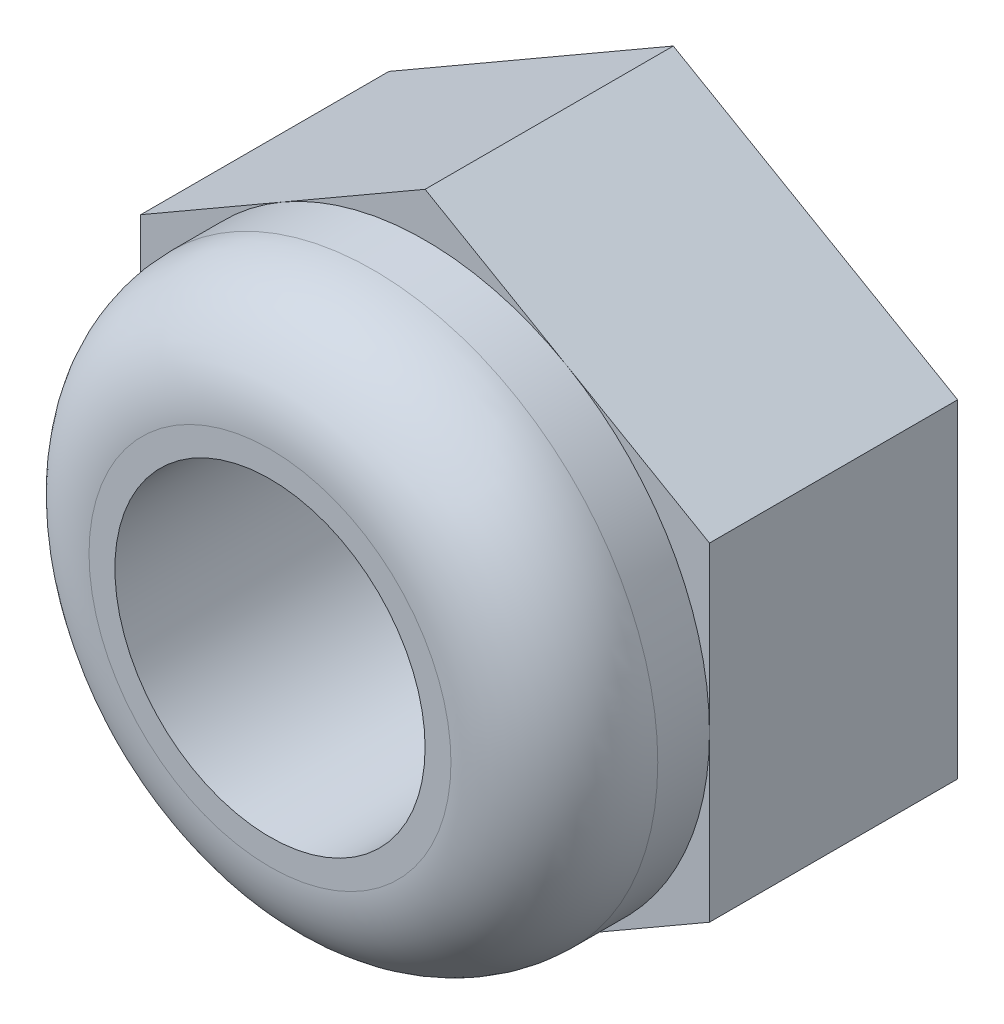
ISO-10303-21;
HEADER;
FILE_DESCRIPTION(('STEP AP214'),'2;1');
FILE_NAME('part.step','',(''),(''),'','','');
FILE_SCHEMA(('AUTOMOTIVE_DESIGN { 1 0 10303 214 1 1 1 1 }'));
ENDSEC;
DATA;
#1=APPLICATION_CONTEXT('core data for automotive mechanical design processes');
#2=APPLICATION_PROTOCOL_DEFINITION('international standard','automotive_design',2000,#1);
#3=PRODUCT_CONTEXT('',#1,'mechanical');
#4=PRODUCT('Part','Part','',(#3));
#5=PRODUCT_RELATED_PRODUCT_CATEGORY('part','',(#4));
#6=PRODUCT_DEFINITION_FORMATION('','',#4);
#7=PRODUCT_DEFINITION_CONTEXT('part definition',#1,'design');
#8=PRODUCT_DEFINITION('design','',#6,#7);
#9=PRODUCT_DEFINITION_SHAPE('','',#8);
#10=(LENGTH_UNIT() NAMED_UNIT(*) SI_UNIT(.MILLI.,.METRE.));
#11=(NAMED_UNIT(*) PLANE_ANGLE_UNIT() SI_UNIT($,.RADIAN.));
#12=(NAMED_UNIT(*) SI_UNIT($,.STERADIAN.) SOLID_ANGLE_UNIT());
#13=UNCERTAINTY_MEASURE_WITH_UNIT(LENGTH_MEASURE(1.E-05),#10,'distance_accuracy_value','');
#14=(GEOMETRIC_REPRESENTATION_CONTEXT(3) GLOBAL_UNCERTAINTY_ASSIGNED_CONTEXT((#13)) GLOBAL_UNIT_ASSIGNED_CONTEXT((#10,
#11,#12)) REPRESENTATION_CONTEXT('',''));
#15=CARTESIAN_POINT('',(0.,0.,0.));
#16=DIRECTION('',(0.,0.,1.));
#17=DIRECTION('',(1.,0.,0.));
#18=AXIS2_PLACEMENT_3D('',#15,#16,#17);
#19=CARTESIAN_POINT('',(0.,0.,2.4));
#20=DIRECTION('',(0.,0.,1.));
#21=DIRECTION('',(1.,0.,0.));
#22=AXIS2_PLACEMENT_3D('',#19,#20,#21);
#23=PLANE('',#22);
#24=CARTESIAN_POINT('',(0.,0.,2.4));
#25=DIRECTION('',(0.,0.,1.));
#26=DIRECTION('',(1.,0.,0.));
#27=AXIS2_PLACEMENT_3D('',#24,#25,#26);
#28=CIRCLE('',#27,2.75);
#29=CARTESIAN_POINT('',(2.75,0.,2.4));
#30=VERTEX_POINT('',#29);
#31=CARTESIAN_POINT('',(1.375,2.38156986040721,2.4));
#32=VERTEX_POINT('',#31);
#33=EDGE_CURVE('E131',#30,#32,#28,.T.);
#34=ORIENTED_EDGE('',*,*,#33,.F.);
#35=DIRECTION('',(0.,1.,0.));
#36=VECTOR('',#35,1.);
#37=CARTESIAN_POINT('',(2.75,-1.58771324027147,2.4));
#38=LINE('',#37,#36);
#39=CARTESIAN_POINT('',(2.75,1.58771324027147,2.4));
#40=VERTEX_POINT('',#39);
#41=EDGE_CURVE('E119',#30,#40,#38,.T.);
#42=ORIENTED_EDGE('',*,*,#41,.T.);
#43=DIRECTION('',(-0.866025403784439,0.5,0.));
#44=VECTOR('',#43,1.);
#45=CARTESIAN_POINT('',(2.75,1.58771324027147,2.4));
#46=LINE('',#45,#44);
#47=EDGE_CURVE('E132',#40,#32,#46,.T.);
#48=ORIENTED_EDGE('',*,*,#47,.T.);
#49=EDGE_LOOP('',(#34,#42,#48));
#50=FACE_BOUND('',#49,.T.);
#51=ADVANCED_FACE('F36',(#50),#23,.T.);
#52=CARTESIAN_POINT('',(-1.375,2.38156986040721,2.4));
#53=VERTEX_POINT('',#52);
#54=EDGE_CURVE('E138',#32,#53,#28,.T.);
#55=ORIENTED_EDGE('',*,*,#54,.F.);
#56=CARTESIAN_POINT('',(0.,3.17542648054294,2.4));
#57=VERTEX_POINT('',#56);
#58=EDGE_CURVE('E118',#32,#57,#46,.T.);
#59=ORIENTED_EDGE('',*,*,#58,.T.);
#60=DIRECTION('',(-0.866025403784439,-0.5,0.));
#61=VECTOR('',#60,1.);
#62=CARTESIAN_POINT('',(0.,3.17542648054294,2.4));
#63=LINE('',#62,#61);
#64=EDGE_CURVE('E148',#57,#53,#63,.T.);
#65=ORIENTED_EDGE('',*,*,#64,.T.);
#66=EDGE_LOOP('',(#55,#59,#65));
#67=FACE_BOUND('',#66,.T.);
#68=ADVANCED_FACE('F196',(#67),#23,.T.);
#69=CARTESIAN_POINT('',(-2.75,0.,2.4));
#70=VERTEX_POINT('',#69);
#71=EDGE_CURVE('E185',#53,#70,#28,.T.);
#72=ORIENTED_EDGE('',*,*,#71,.F.);
#73=CARTESIAN_POINT('',(-2.75,1.58771324027147,2.4));
#74=VERTEX_POINT('',#73);
#75=EDGE_CURVE('E147',#53,#74,#63,.T.);
#76=ORIENTED_EDGE('',*,*,#75,.T.);
#77=DIRECTION('',(0.,-1.,0.));
#78=VECTOR('',#77,1.);
#79=CARTESIAN_POINT('',(-2.75,1.58771324027147,2.4));
#80=LINE('',#79,#78);
#81=EDGE_CURVE('E152',#74,#70,#80,.T.);
#82=ORIENTED_EDGE('',*,*,#81,.T.);
#83=EDGE_LOOP('',(#72,#76,#82));
#84=FACE_BOUND('',#83,.T.);
#85=ADVANCED_FACE('F189',(#84),#23,.T.);
#86=CARTESIAN_POINT('',(-1.375,-2.38156986040721,2.4));
#87=VERTEX_POINT('',#86);
#88=EDGE_CURVE('E59',#70,#87,#28,.T.);
#89=ORIENTED_EDGE('',*,*,#88,.F.);
#90=CARTESIAN_POINT('',(-2.75,-1.58771324027147,2.4));
#91=VERTEX_POINT('',#90);
#92=EDGE_CURVE('E151',#70,#91,#80,.T.);
#93=ORIENTED_EDGE('',*,*,#92,.T.);
#94=DIRECTION('',(0.866025403784439,-0.5,0.));
#95=VECTOR('',#94,1.);
#96=CARTESIAN_POINT('',(-2.75,-1.58771324027147,2.4));
#97=LINE('',#96,#95);
#98=EDGE_CURVE('E156',#91,#87,#97,.T.);
#99=ORIENTED_EDGE('',*,*,#98,.T.);
#100=EDGE_LOOP('',(#89,#93,#99));
#101=FACE_BOUND('',#100,.T.);
#102=ADVANCED_FACE('F215',(#101),#23,.T.);
#103=CARTESIAN_POINT('',(1.375,-2.3815698604072,2.4));
#104=VERTEX_POINT('',#103);
#105=EDGE_CURVE('E51',#87,#104,#28,.T.);
#106=ORIENTED_EDGE('',*,*,#105,.F.);
#107=CARTESIAN_POINT('',(0.,-3.17542648054294,2.4));
#108=VERTEX_POINT('',#107);
#109=EDGE_CURVE('E155',#87,#108,#97,.T.);
#110=ORIENTED_EDGE('',*,*,#109,.T.);
#111=DIRECTION('',(0.866025403784438,0.5,0.));
#112=VECTOR('',#111,1.);
#113=CARTESIAN_POINT('',(0.,-3.17542648054294,2.4));
#114=LINE('',#113,#112);
#115=EDGE_CURVE('E129',#108,#104,#114,.T.);
#116=ORIENTED_EDGE('',*,*,#115,.T.);
#117=EDGE_LOOP('',(#106,#110,#116));
#118=FACE_BOUND('',#117,.T.);
#119=ADVANCED_FACE('F217',(#118),#23,.T.);
#120=CARTESIAN_POINT('',(0.,-3.17542648054294,2.4));
#121=DIRECTION('',(-0.5,0.866025403784438,0.));
#122=DIRECTION('',(-0.866025403784438,-0.5,0.));
#123=AXIS2_PLACEMENT_3D('',#120,#121,#122);
#124=PLANE('',#123);
#125=DIRECTION('',(0.866025403784438,0.5,0.));
#126=VECTOR('',#125,1.);
#127=CARTESIAN_POINT('',(0.,-3.17542648054294,0.));
#128=LINE('',#127,#126);
#129=CARTESIAN_POINT('',(0.,-3.17542648054294,0.));
#130=VERTEX_POINT('',#129);
#131=CARTESIAN_POINT('',(2.75,-1.58771324027147,0.));
#132=VERTEX_POINT('',#131);
#133=EDGE_CURVE('E135',#130,#132,#128,.T.);
#134=ORIENTED_EDGE('',*,*,#133,.T.);
#135=DIRECTION('',(0.,0.,-1.));
#136=VECTOR('',#135,1.);
#137=CARTESIAN_POINT('',(2.75,-1.58771324027147,2.4));
#138=LINE('',#137,#136);
#139=CARTESIAN_POINT('',(2.75,-1.58771324027147,2.4));
#140=VERTEX_POINT('',#139);
#141=EDGE_CURVE('E140',#140,#132,#138,.T.);
#142=ORIENTED_EDGE('',*,*,#141,.F.);
#143=EDGE_CURVE('E114',#104,#140,#114,.T.);
#144=ORIENTED_EDGE('',*,*,#143,.F.);
#145=ORIENTED_EDGE('',*,*,#115,.F.);
#146=DIRECTION('',(0.,0.,-1.));
#147=VECTOR('',#146,1.);
#148=CARTESIAN_POINT('',(0.,-3.17542648054294,2.4));
#149=LINE('',#148,#147);
#150=EDGE_CURVE('E158',#108,#130,#149,.T.);
#151=ORIENTED_EDGE('',*,*,#150,.T.);
#152=EDGE_LOOP('',(#134,#142,#144,#145,#151));
#153=FACE_BOUND('',#152,.T.);
#154=ADVANCED_FACE('F223',(#153),#124,.F.);
#155=CARTESIAN_POINT('',(2.75,-1.58771324027147,2.4));
#156=DIRECTION('',(-1.,0.,0.));
#157=DIRECTION('',(0.,-1.,0.));
#158=AXIS2_PLACEMENT_3D('',#155,#156,#157);
#159=PLANE('',#158);
#160=DIRECTION('',(0.,1.,0.));
#161=VECTOR('',#160,1.);
#162=CARTESIAN_POINT('',(2.75,-1.58771324027147,0.));
#163=LINE('',#162,#161);
#164=CARTESIAN_POINT('',(2.75,1.58771324027147,0.));
#165=VERTEX_POINT('',#164);
#166=EDGE_CURVE('E161',#132,#165,#163,.T.);
#167=ORIENTED_EDGE('',*,*,#166,.T.);
#168=DIRECTION('',(0.,0.,-1.));
#169=VECTOR('',#168,1.);
#170=CARTESIAN_POINT('',(2.75,1.58771324027147,2.4));
#171=LINE('',#170,#169);
#172=EDGE_CURVE('E125',#40,#165,#171,.T.);
#173=ORIENTED_EDGE('',*,*,#172,.F.);
#174=ORIENTED_EDGE('',*,*,#41,.F.);
#175=EDGE_CURVE('E108',#140,#30,#38,.T.);
#176=ORIENTED_EDGE('',*,*,#175,.F.);
#177=ORIENTED_EDGE('',*,*,#141,.T.);
#178=EDGE_LOOP('',(#167,#173,#174,#176,#177));
#179=FACE_BOUND('',#178,.T.);
#180=ADVANCED_FACE('F123',(#179),#159,.F.);
#181=CARTESIAN_POINT('',(2.75,1.58771324027147,2.4));
#182=DIRECTION('',(-0.5,-0.866025403784439,0.));
#183=DIRECTION('',(0.866025403784439,-0.5,0.));
#184=AXIS2_PLACEMENT_3D('',#181,#182,#183);
#185=PLANE('',#184);
#186=DIRECTION('',(-0.866025403784439,0.5,0.));
#187=VECTOR('',#186,1.);
#188=CARTESIAN_POINT('',(2.75,1.58771324027147,0.));
#189=LINE('',#188,#187);
#190=CARTESIAN_POINT('',(0.,3.17542648054294,0.));
#191=VERTEX_POINT('',#190);
#192=EDGE_CURVE('E163',#165,#191,#189,.T.);
#193=ORIENTED_EDGE('',*,*,#192,.T.);
#194=DIRECTION('',(0.,0.,-1.));
#195=VECTOR('',#194,1.);
#196=CARTESIAN_POINT('',(0.,3.17542648054294,2.4));
#197=LINE('',#196,#195);
#198=EDGE_CURVE('E179',#57,#191,#197,.T.);
#199=ORIENTED_EDGE('',*,*,#198,.F.);
#200=ORIENTED_EDGE('',*,*,#58,.F.);
#201=ORIENTED_EDGE('',*,*,#47,.F.);
#202=ORIENTED_EDGE('',*,*,#172,.T.);
#203=EDGE_LOOP('',(#193,#199,#200,#201,#202));
#204=FACE_BOUND('',#203,.T.);
#205=ADVANCED_FACE('F200',(#204),#185,.F.);
#206=CARTESIAN_POINT('',(0.,3.17542648054294,2.4));
#207=DIRECTION('',(0.5,-0.866025403784439,0.));
#208=DIRECTION('',(0.866025403784439,0.5,0.));
#209=AXIS2_PLACEMENT_3D('',#206,#207,#208);
#210=PLANE('',#209);
#211=DIRECTION('',(-0.866025403784439,-0.5,0.));
#212=VECTOR('',#211,1.);
#213=CARTESIAN_POINT('',(0.,3.17542648054294,0.));
#214=LINE('',#213,#212);
#215=CARTESIAN_POINT('',(-2.75,1.58771324027147,0.));
#216=VERTEX_POINT('',#215);
#217=EDGE_CURVE('E165',#191,#216,#214,.T.);
#218=ORIENTED_EDGE('',*,*,#217,.T.);
#219=DIRECTION('',(0.,0.,-1.));
#220=VECTOR('',#219,1.);
#221=CARTESIAN_POINT('',(-2.75,1.58771324027147,2.4));
#222=LINE('',#221,#220);
#223=EDGE_CURVE('E176',#74,#216,#222,.T.);
#224=ORIENTED_EDGE('',*,*,#223,.F.);
#225=ORIENTED_EDGE('',*,*,#75,.F.);
#226=ORIENTED_EDGE('',*,*,#64,.F.);
#227=ORIENTED_EDGE('',*,*,#198,.T.);
#228=EDGE_LOOP('',(#218,#224,#225,#226,#227));
#229=FACE_BOUND('',#228,.T.);
#230=ADVANCED_FACE('F194',(#229),#210,.F.);
#231=CARTESIAN_POINT('',(-2.75,1.58771324027147,2.4));
#232=DIRECTION('',(1.,0.,0.));
#233=DIRECTION('',(0.,1.,0.));
#234=AXIS2_PLACEMENT_3D('',#231,#232,#233);
#235=PLANE('',#234);
#236=DIRECTION('',(0.,-1.,0.));
#237=VECTOR('',#236,1.);
#238=CARTESIAN_POINT('',(-2.75,1.58771324027147,0.));
#239=LINE('',#238,#237);
#240=CARTESIAN_POINT('',(-2.75,-1.58771324027147,0.));
#241=VERTEX_POINT('',#240);
#242=EDGE_CURVE('E167',#216,#241,#239,.T.);
#243=ORIENTED_EDGE('',*,*,#242,.T.);
#244=DIRECTION('',(0.,0.,-1.));
#245=VECTOR('',#244,1.);
#246=CARTESIAN_POINT('',(-2.75,-1.58771324027147,2.4));
#247=LINE('',#246,#245);
#248=EDGE_CURVE('E173',#91,#241,#247,.T.);
#249=ORIENTED_EDGE('',*,*,#248,.F.);
#250=ORIENTED_EDGE('',*,*,#92,.F.);
#251=ORIENTED_EDGE('',*,*,#81,.F.);
#252=ORIENTED_EDGE('',*,*,#223,.T.);
#253=EDGE_LOOP('',(#243,#249,#250,#251,#252));
#254=FACE_BOUND('',#253,.T.);
#255=ADVANCED_FACE('F210',(#254),#235,.F.);
#256=CARTESIAN_POINT('',(-2.75,-1.58771324027147,2.4));
#257=DIRECTION('',(0.5,0.866025403784439,0.));
#258=DIRECTION('',(-0.866025403784439,0.5,0.));
#259=AXIS2_PLACEMENT_3D('',#256,#257,#258);
#260=PLANE('',#259);
#261=DIRECTION('',(0.866025403784439,-0.5,0.));
#262=VECTOR('',#261,1.);
#263=CARTESIAN_POINT('',(-2.75,-1.58771324027147,0.));
#264=LINE('',#263,#262);
#265=EDGE_CURVE('E169',#241,#130,#264,.T.);
#266=ORIENTED_EDGE('',*,*,#265,.T.);
#267=ORIENTED_EDGE('',*,*,#150,.F.);
#268=ORIENTED_EDGE('',*,*,#109,.F.);
#269=ORIENTED_EDGE('',*,*,#98,.F.);
#270=ORIENTED_EDGE('',*,*,#248,.T.);
#271=EDGE_LOOP('',(#266,#267,#268,#269,#270));
#272=FACE_BOUND('',#271,.T.);
#273=ADVANCED_FACE('F213',(#272),#260,.F.);
#274=EDGE_CURVE('E112',#104,#30,#28,.T.);
#275=ORIENTED_EDGE('',*,*,#274,.F.);
#276=ORIENTED_EDGE('',*,*,#143,.T.);
#277=ORIENTED_EDGE('',*,*,#175,.T.);
#278=EDGE_LOOP('',(#275,#276,#277));
#279=FACE_BOUND('',#278,.T.);
#280=ADVANCED_FACE('F110',(#279),#23,.T.);
#281=CARTESIAN_POINT('',(0.,0.,0.));
#282=DIRECTION('',(0.,0.,1.));
#283=DIRECTION('',(1.,0.,0.));
#284=AXIS2_PLACEMENT_3D('',#281,#282,#283);
#285=PLANE('',#284);
#286=CARTESIAN_POINT('',(0.,0.,0.));
#287=DIRECTION('',(0.,0.,1.));
#288=DIRECTION('',(1.,0.,0.));
#289=AXIS2_PLACEMENT_3D('',#286,#287,#288);
#290=CIRCLE('',#289,1.5);
#291=CARTESIAN_POINT('',(1.5,0.,0.));
#292=VERTEX_POINT('',#291);
#293=EDGE_CURVE('E136',#292,#292,#290,.T.);
#294=ORIENTED_EDGE('',*,*,#293,.T.);
#295=EDGE_LOOP('',(#294));
#296=FACE_BOUND('',#295,.T.);
#297=ORIENTED_EDGE('',*,*,#133,.F.);
#298=ORIENTED_EDGE('',*,*,#265,.F.);
#299=ORIENTED_EDGE('',*,*,#242,.F.);
#300=ORIENTED_EDGE('',*,*,#217,.F.);
#301=ORIENTED_EDGE('',*,*,#192,.F.);
#302=ORIENTED_EDGE('',*,*,#166,.F.);
#303=EDGE_LOOP('',(#297,#298,#299,#300,#301,#302));
#304=FACE_BOUND('',#303,.T.);
#305=ADVANCED_FACE('F206',(#296,#304),#285,.F.);
#306=CARTESIAN_POINT('',(0.,0.,3.9));
#307=DIRECTION('',(0.,0.,-1.));
#308=DIRECTION('',(-1.,0.,0.));
#309=AXIS2_PLACEMENT_3D('',#306,#307,#308);
#310=CYLINDRICAL_SURFACE('',#309,2.75);
#311=CARTESIAN_POINT('',(0.,0.,2.9));
#312=DIRECTION('',(0.,0.,1.));
#313=DIRECTION('',(1.,0.,0.));
#314=AXIS2_PLACEMENT_3D('',#311,#312,#313);
#315=CIRCLE('',#314,2.75);
#316=CARTESIAN_POINT('',(2.75,0.,2.9));
#317=VERTEX_POINT('',#316);
#318=EDGE_CURVE('E11',#317,#317,#315,.F.);
#319=ORIENTED_EDGE('',*,*,#318,.T.);
#320=EDGE_LOOP('',(#319));
#321=FACE_BOUND('',#320,.T.);
#322=ORIENTED_EDGE('',*,*,#33,.T.);
#323=ORIENTED_EDGE('',*,*,#54,.T.);
#324=ORIENTED_EDGE('',*,*,#71,.T.);
#325=ORIENTED_EDGE('',*,*,#88,.T.);
#326=ORIENTED_EDGE('',*,*,#105,.T.);
#327=ORIENTED_EDGE('',*,*,#274,.T.);
#328=EDGE_LOOP('',(#322,#323,#324,#325,#326,#327));
#329=FACE_BOUND('',#328,.T.);
#330=ADVANCED_FACE('F139',(#321,#329),#310,.T.);
#331=CARTESIAN_POINT('',(0.,0.,3.9));
#332=DIRECTION('',(0.,0.,1.));
#333=DIRECTION('',(1.,0.,0.));
#334=AXIS2_PLACEMENT_3D('',#331,#332,#333);
#335=PLANE('',#334);
#336=CARTESIAN_POINT('',(0.,0.,3.9));
#337=DIRECTION('',(0.,0.,1.));
#338=DIRECTION('',(1.,0.,0.));
#339=AXIS2_PLACEMENT_3D('',#336,#337,#338);
#340=CIRCLE('',#339,1.5);
#341=CARTESIAN_POINT('',(1.5,0.,3.9));
#342=VERTEX_POINT('',#341);
#343=EDGE_CURVE('E329',#342,#342,#340,.T.);
#344=ORIENTED_EDGE('',*,*,#343,.F.);
#345=EDGE_LOOP('',(#344));
#346=FACE_BOUND('',#345,.T.);
#347=CARTESIAN_POINT('',(0.,0.,3.9));
#348=DIRECTION('',(0.,0.,1.));
#349=DIRECTION('',(1.,0.,0.));
#350=AXIS2_PLACEMENT_3D('',#347,#348,#349);
#351=CIRCLE('',#350,1.75);
#352=CARTESIAN_POINT('',(1.75,0.,3.9));
#353=VERTEX_POINT('',#352);
#354=EDGE_CURVE('E44',#353,#353,#351,.T.);
#355=ORIENTED_EDGE('',*,*,#354,.T.);
#356=EDGE_LOOP('',(#355));
#357=FACE_BOUND('',#356,.T.);
#358=ADVANCED_FACE('F288',(#346,#357),#335,.T.);
#359=CARTESIAN_POINT('',(0.,0.,2.9));
#360=DIRECTION('',(0.,0.,1.));
#361=DIRECTION('',(1.,0.,0.));
#362=AXIS2_PLACEMENT_3D('',#359,#360,#361);
#363=TOROIDAL_SURFACE('',#362,1.75,1.);
#364=ORIENTED_EDGE('',*,*,#318,.F.);
#365=EDGE_LOOP('',(#364));
#366=FACE_BOUND('',#365,.T.);
#367=ORIENTED_EDGE('',*,*,#354,.F.);
#368=EDGE_LOOP('',(#367));
#369=FACE_BOUND('',#368,.T.);
#370=ADVANCED_FACE('F38',(#366,#369),#363,.T.);
#371=CARTESIAN_POINT('',(0.,0.,-5.6));
#372=DIRECTION('',(0.,0.,1.));
#373=DIRECTION('',(1.,0.,0.));
#374=AXIS2_PLACEMENT_3D('',#371,#372,#373);
#375=CYLINDRICAL_SURFACE('',#374,1.5);
#376=ORIENTED_EDGE('',*,*,#343,.T.);
#377=EDGE_LOOP('',(#376));
#378=FACE_BOUND('',#377,.T.);
#379=ORIENTED_EDGE('',*,*,#293,.F.);
#380=EDGE_LOOP('',(#379));
#381=FACE_BOUND('',#380,.T.);
#382=ADVANCED_FACE('F300',(#378,#381),#375,.F.);
#383=CLOSED_SHELL('',(#51,#68,#85,#102,#119,#154,#180,#205,#230,#255,#273,#280,#305,#330,#358,
#370,#382));
#384=MANIFOLD_SOLID_BREP('B2',#383);
#385=ADVANCED_BREP_SHAPE_REPRESENTATION('',(#18,#384),#14);
#386=SHAPE_DEFINITION_REPRESENTATION(#9,#385);
ENDSEC;
END-ISO-10303-21;
